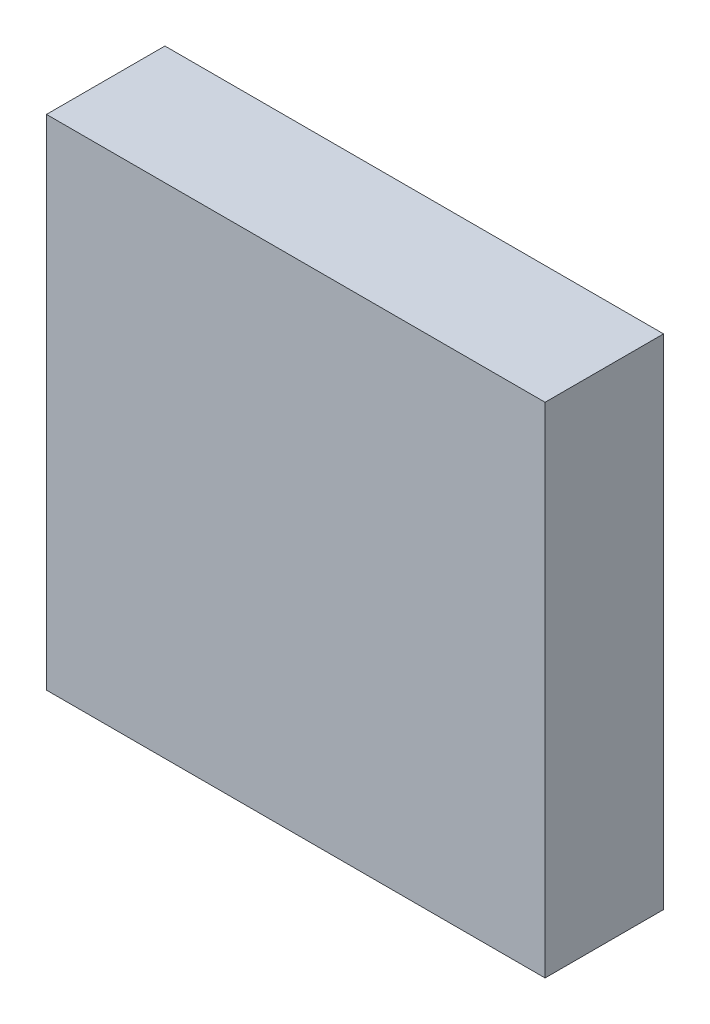
ISO-10303-21;
HEADER;
FILE_DESCRIPTION(('STEP AP214'),'2;1');
FILE_NAME('part.step','',(''),(''),'','','');
FILE_SCHEMA(('AUTOMOTIVE_DESIGN { 1 0 10303 214 1 1 1 1 }'));
ENDSEC;
DATA;
#1=APPLICATION_CONTEXT('core data for automotive mechanical design processes');
#2=APPLICATION_PROTOCOL_DEFINITION('international standard','automotive_design',2000,#1);
#3=PRODUCT_CONTEXT('',#1,'mechanical');
#4=PRODUCT('Part','Part','',(#3));
#5=PRODUCT_RELATED_PRODUCT_CATEGORY('part','',(#4));
#6=PRODUCT_DEFINITION_FORMATION('','',#4);
#7=PRODUCT_DEFINITION_CONTEXT('part definition',#1,'design');
#8=PRODUCT_DEFINITION('design','',#6,#7);
#9=PRODUCT_DEFINITION_SHAPE('','',#8);
#10=(LENGTH_UNIT() NAMED_UNIT(*) SI_UNIT(.MILLI.,.METRE.));
#11=(NAMED_UNIT(*) PLANE_ANGLE_UNIT() SI_UNIT($,.RADIAN.));
#12=(NAMED_UNIT(*) SI_UNIT($,.STERADIAN.) SOLID_ANGLE_UNIT());
#13=UNCERTAINTY_MEASURE_WITH_UNIT(LENGTH_MEASURE(1.E-05),#10,'distance_accuracy_value','');
#14=(GEOMETRIC_REPRESENTATION_CONTEXT(3) GLOBAL_UNCERTAINTY_ASSIGNED_CONTEXT((#13)) GLOBAL_UNIT_ASSIGNED_CONTEXT((#10,
#11,#12)) REPRESENTATION_CONTEXT('',''));
#15=CARTESIAN_POINT('',(0.,0.,0.));
#16=DIRECTION('',(0.,0.,1.));
#17=DIRECTION('',(1.,0.,0.));
#18=AXIS2_PLACEMENT_3D('',#15,#16,#17);
#19=CARTESIAN_POINT('',(1.99949308,-1.99949308,0.95000064));
#20=DIRECTION('',(0.,0.,1.));
#21=DIRECTION('',(1.,0.,0.));
#22=AXIS2_PLACEMENT_3D('',#19,#20,#21);
#23=PLANE('',#22);
#24=DIRECTION('',(0.,1.,0.));
#25=VECTOR('',#24,1.);
#26=CARTESIAN_POINT('',(-1.99949308,-1.99949308,0.95000064));
#27=LINE('',#26,#25);
#28=CARTESIAN_POINT('',(-1.99949308,-1.99949308,0.95000064));
#29=VERTEX_POINT('',#28);
#30=CARTESIAN_POINT('',(-1.99949308,1.99949308,0.95000064));
#31=VERTEX_POINT('',#30);
#32=EDGE_CURVE('E53',#29,#31,#27,.T.);
#33=ORIENTED_EDGE('',*,*,#32,.F.);
#34=DIRECTION('',(1.,0.,0.));
#35=VECTOR('',#34,1.);
#36=CARTESIAN_POINT('',(1.99949308,-1.99949308,0.95000064));
#37=LINE('',#36,#35);
#38=CARTESIAN_POINT('',(1.99949308,-1.99949308,0.95000064));
#39=VERTEX_POINT('',#38);
#40=EDGE_CURVE('E68',#39,#29,#37,.F.);
#41=ORIENTED_EDGE('',*,*,#40,.F.);
#42=DIRECTION('',(0.,1.,0.));
#43=VECTOR('',#42,1.);
#44=CARTESIAN_POINT('',(1.99949308,1.99949308,0.95000064));
#45=LINE('',#44,#43);
#46=CARTESIAN_POINT('',(1.99949308,1.99949308,0.95000064));
#47=VERTEX_POINT('',#46);
#48=EDGE_CURVE('E20',#47,#39,#45,.F.);
#49=ORIENTED_EDGE('',*,*,#48,.F.);
#50=DIRECTION('',(1.,0.,0.));
#51=VECTOR('',#50,1.);
#52=CARTESIAN_POINT('',(-1.99949308,1.99949308,0.95000064));
#53=LINE('',#52,#51);
#54=EDGE_CURVE('E58',#31,#47,#53,.T.);
#55=ORIENTED_EDGE('',*,*,#54,.F.);
#56=EDGE_LOOP('',(#33,#41,#49,#55));
#57=FACE_BOUND('',#56,.T.);
#58=ADVANCED_FACE('F17',(#57),#23,.T.);
#59=CARTESIAN_POINT('',(1.99949308,1.99949308,0.));
#60=DIRECTION('',(1.,0.,0.));
#61=DIRECTION('',(0.,0.,-1.));
#62=AXIS2_PLACEMENT_3D('',#59,#60,#61);
#63=PLANE('',#62);
#64=DIRECTION('',(0.,0.,-1.));
#65=VECTOR('',#64,1.);
#66=CARTESIAN_POINT('',(1.99949308,-1.99949308,0.));
#67=LINE('',#66,#65);
#68=CARTESIAN_POINT('',(1.99949308,-1.99949308,0.));
#69=VERTEX_POINT('',#68);
#70=EDGE_CURVE('E79',#69,#39,#67,.F.);
#71=ORIENTED_EDGE('',*,*,#70,.F.);
#72=DIRECTION('',(0.,1.,0.));
#73=VECTOR('',#72,1.);
#74=CARTESIAN_POINT('',(1.99949308,-1.99949308,0.));
#75=LINE('',#74,#73);
#76=CARTESIAN_POINT('',(1.99949308,1.99949308,0.));
#77=VERTEX_POINT('',#76);
#78=EDGE_CURVE('E74',#69,#77,#75,.T.);
#79=ORIENTED_EDGE('',*,*,#78,.T.);
#80=DIRECTION('',(0.,0.,1.));
#81=VECTOR('',#80,1.);
#82=CARTESIAN_POINT('',(1.99949308,1.99949308,0.));
#83=LINE('',#82,#81);
#84=EDGE_CURVE('E63',#47,#77,#83,.F.);
#85=ORIENTED_EDGE('',*,*,#84,.F.);
#86=ORIENTED_EDGE('',*,*,#48,.T.);
#87=EDGE_LOOP('',(#71,#79,#85,#86));
#88=FACE_BOUND('',#87,.T.);
#89=ADVANCED_FACE('F73',(#88),#63,.T.);
#90=CARTESIAN_POINT('',(-1.99949308,1.99949308,0.));
#91=DIRECTION('',(0.,1.,0.));
#92=DIRECTION('',(0.,0.,1.));
#93=AXIS2_PLACEMENT_3D('',#90,#91,#92);
#94=PLANE('',#93);
#95=ORIENTED_EDGE('',*,*,#84,.T.);
#96=DIRECTION('',(1.,0.,0.));
#97=VECTOR('',#96,1.);
#98=CARTESIAN_POINT('',(1.99949308,1.99949308,0.));
#99=LINE('',#98,#97);
#100=CARTESIAN_POINT('',(-1.99949308,1.99949308,0.));
#101=VERTEX_POINT('',#100);
#102=EDGE_CURVE('E84',#77,#101,#99,.F.);
#103=ORIENTED_EDGE('',*,*,#102,.T.);
#104=DIRECTION('',(0.,0.,1.));
#105=VECTOR('',#104,1.);
#106=CARTESIAN_POINT('',(-1.99949308,1.99949308,0.));
#107=LINE('',#106,#105);
#108=EDGE_CURVE('E65',#31,#101,#107,.F.);
#109=ORIENTED_EDGE('',*,*,#108,.F.);
#110=ORIENTED_EDGE('',*,*,#54,.T.);
#111=EDGE_LOOP('',(#95,#103,#109,#110));
#112=FACE_BOUND('',#111,.T.);
#113=ADVANCED_FACE('F60',(#112),#94,.T.);
#114=CARTESIAN_POINT('',(-1.99949308,-1.99949308,0.));
#115=DIRECTION('',(-1.,0.,0.));
#116=DIRECTION('',(0.,0.,1.));
#117=AXIS2_PLACEMENT_3D('',#114,#115,#116);
#118=PLANE('',#117);
#119=ORIENTED_EDGE('',*,*,#108,.T.);
#120=DIRECTION('',(0.,1.,0.));
#121=VECTOR('',#120,1.);
#122=CARTESIAN_POINT('',(-1.99949308,-1.99949308,0.));
#123=LINE('',#122,#121);
#124=CARTESIAN_POINT('',(-1.99949308,-1.99949308,0.));
#125=VERTEX_POINT('',#124);
#126=EDGE_CURVE('E26',#101,#125,#123,.F.);
#127=ORIENTED_EDGE('',*,*,#126,.T.);
#128=DIRECTION('',(0.,0.,-1.));
#129=VECTOR('',#128,1.);
#130=CARTESIAN_POINT('',(-1.99949308,-1.99949308,0.));
#131=LINE('',#130,#129);
#132=EDGE_CURVE('E34',#29,#125,#131,.T.);
#133=ORIENTED_EDGE('',*,*,#132,.F.);
#134=ORIENTED_EDGE('',*,*,#32,.T.);
#135=EDGE_LOOP('',(#119,#127,#133,#134));
#136=FACE_BOUND('',#135,.T.);
#137=ADVANCED_FACE('F88',(#136),#118,.T.);
#138=CARTESIAN_POINT('',(1.99949308,-1.99949308,0.));
#139=DIRECTION('',(0.,-1.,0.));
#140=DIRECTION('',(0.,0.,-1.));
#141=AXIS2_PLACEMENT_3D('',#138,#139,#140);
#142=PLANE('',#141);
#143=ORIENTED_EDGE('',*,*,#132,.T.);
#144=DIRECTION('',(1.,0.,0.));
#145=VECTOR('',#144,1.);
#146=CARTESIAN_POINT('',(1.99949308,-1.99949308,0.));
#147=LINE('',#146,#145);
#148=EDGE_CURVE('E11',#125,#69,#147,.T.);
#149=ORIENTED_EDGE('',*,*,#148,.T.);
#150=ORIENTED_EDGE('',*,*,#70,.T.);
#151=ORIENTED_EDGE('',*,*,#40,.T.);
#152=EDGE_LOOP('',(#143,#149,#150,#151));
#153=FACE_BOUND('',#152,.T.);
#154=ADVANCED_FACE('F91',(#153),#142,.T.);
#155=CARTESIAN_POINT('',(1.99949308,-1.99949308,0.));
#156=DIRECTION('',(0.,0.,1.));
#157=DIRECTION('',(1.,0.,0.));
#158=AXIS2_PLACEMENT_3D('',#155,#156,#157);
#159=PLANE('',#158);
#160=ORIENTED_EDGE('',*,*,#126,.F.);
#161=ORIENTED_EDGE('',*,*,#102,.F.);
#162=ORIENTED_EDGE('',*,*,#78,.F.);
#163=ORIENTED_EDGE('',*,*,#148,.F.);
#164=EDGE_LOOP('',(#160,#161,#162,#163));
#165=FACE_BOUND('',#164,.T.);
#166=ADVANCED_FACE('F90',(#165),#159,.F.);
#167=CLOSED_SHELL('',(#58,#89,#113,#137,#154,#166));
#168=MANIFOLD_SOLID_BREP('B1',#167);
#169=ADVANCED_BREP_SHAPE_REPRESENTATION('',(#18,#168),#14);
#170=SHAPE_DEFINITION_REPRESENTATION(#9,#169);
ENDSEC;
END-ISO-10303-21;
